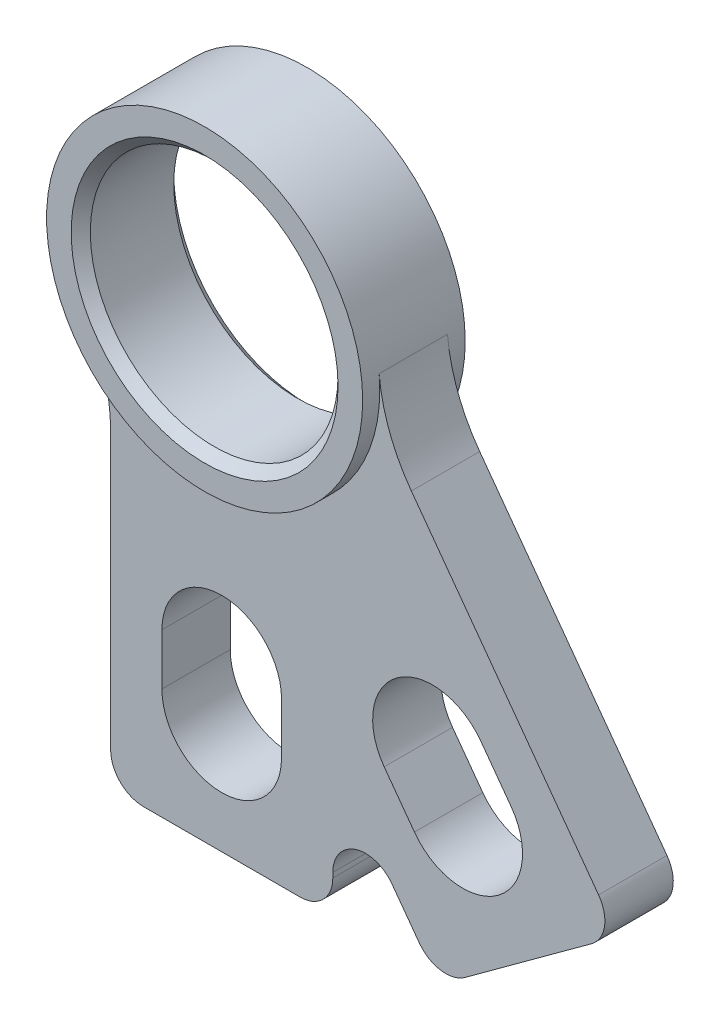
ISO-10303-21;
HEADER;
FILE_DESCRIPTION(('STEP AP214'),'2;1');
FILE_NAME('part.step','',(''),(''),'','','');
FILE_SCHEMA(('AUTOMOTIVE_DESIGN { 1 0 10303 214 1 1 1 1 }'));
ENDSEC;
DATA;
#1=APPLICATION_CONTEXT('core data for automotive mechanical design processes');
#2=APPLICATION_PROTOCOL_DEFINITION('international standard','automotive_design',2000,#1);
#3=PRODUCT_CONTEXT('',#1,'mechanical');
#4=PRODUCT('Part','Part','',(#3));
#5=PRODUCT_RELATED_PRODUCT_CATEGORY('part','',(#4));
#6=PRODUCT_DEFINITION_FORMATION('','',#4);
#7=PRODUCT_DEFINITION_CONTEXT('part definition',#1,'design');
#8=PRODUCT_DEFINITION('design','',#6,#7);
#9=PRODUCT_DEFINITION_SHAPE('','',#8);
#10=(LENGTH_UNIT() NAMED_UNIT(*) SI_UNIT(.MILLI.,.METRE.));
#11=(NAMED_UNIT(*) PLANE_ANGLE_UNIT() SI_UNIT($,.RADIAN.));
#12=(NAMED_UNIT(*) SI_UNIT($,.STERADIAN.) SOLID_ANGLE_UNIT());
#13=UNCERTAINTY_MEASURE_WITH_UNIT(LENGTH_MEASURE(1.E-05),#10,'distance_accuracy_value','');
#14=(GEOMETRIC_REPRESENTATION_CONTEXT(3) GLOBAL_UNCERTAINTY_ASSIGNED_CONTEXT((#13)) GLOBAL_UNIT_ASSIGNED_CONTEXT((#10,
#11,#12)) REPRESENTATION_CONTEXT('',''));
#15=CARTESIAN_POINT('',(0.,0.,0.));
#16=DIRECTION('',(0.,0.,1.));
#17=DIRECTION('',(1.,0.,0.));
#18=AXIS2_PLACEMENT_3D('',#15,#16,#17);
#19=CARTESIAN_POINT('',(0.,0.,4.7625));
#20=DIRECTION('',(0.,0.,-1.));
#21=DIRECTION('',(-1.,0.,0.));
#22=AXIS2_PLACEMENT_3D('',#19,#20,#21);
#23=CYLINDRICAL_SURFACE('',#22,11.5062);
#24=CARTESIAN_POINT('',(0.,0.,-3.87350000000002));
#25=DIRECTION('',(0.,0.,1.));
#26=DIRECTION('',(1.,0.,0.));
#27=AXIS2_PLACEMENT_3D('',#24,#25,#26);
#28=CIRCLE('',#27,11.5062);
#29=CARTESIAN_POINT('',(-11.5062,0.,-3.87350000000002));
#30=VERTEX_POINT('',#29);
#31=EDGE_CURVE('E48',#30,#30,#28,.F.);
#32=CARTESIAN_POINT('',(0.,0.,3.87349999999994));
#33=DIRECTION('',(0.,0.,1.));
#34=DIRECTION('',(1.,0.,0.));
#35=AXIS2_PLACEMENT_3D('',#32,#33,#34);
#36=CIRCLE('',#35,11.5062);
#37=CARTESIAN_POINT('',(-11.5062,0.,3.87349999999993));
#38=VERTEX_POINT('',#37);
#39=EDGE_CURVE('E423',#38,#38,#36,.T.);
#40=CARTESIAN_POINT('',(-11.5062,0.,-3.87350000000002));
#41=CARTESIAN_POINT('',(-11.5062,0.,-3.79280208333335));
#42=CARTESIAN_POINT('',(-11.5062,0.,-3.71210416666669));
#43=CARTESIAN_POINT('',(-11.5062,0.,-3.55070833333336));
#44=CARTESIAN_POINT('',(-11.5062,0.,-3.47001041666669));
#45=CARTESIAN_POINT('',(-11.5062,0.,-3.30861458333336));
#46=CARTESIAN_POINT('',(-11.5062,0.,-3.22791666666669));
#47=CARTESIAN_POINT('',(-11.5062,0.,-3.06652083333336));
#48=CARTESIAN_POINT('',(-11.5062,0.,-2.98582291666669));
#49=CARTESIAN_POINT('',(-11.5062,0.,-2.82442708333336));
#50=CARTESIAN_POINT('',(-11.5062,0.,-2.74372916666669));
#51=CARTESIAN_POINT('',(-11.5062,0.,-2.58233333333336));
#52=CARTESIAN_POINT('',(-11.5062,0.,-2.50163541666669));
#53=CARTESIAN_POINT('',(-11.5062,0.,-2.34023958333336));
#54=CARTESIAN_POINT('',(-11.5062,0.,-2.2595416666667));
#55=CARTESIAN_POINT('',(-11.5062,0.,-2.09814583333336));
#56=CARTESIAN_POINT('',(-11.5062,0.,-2.0174479166667));
#57=CARTESIAN_POINT('',(-11.5062,0.,-1.85605208333337));
#58=CARTESIAN_POINT('',(-11.5062,0.,-1.7753541666667));
#59=CARTESIAN_POINT('',(-11.5062,0.,-1.61395833333337));
#60=CARTESIAN_POINT('',(-11.5062,0.,-1.5332604166667));
#61=CARTESIAN_POINT('',(-11.5062,0.,-1.37186458333337));
#62=CARTESIAN_POINT('',(-11.5062,0.,-1.2911666666667));
#63=CARTESIAN_POINT('',(-11.5062,0.,-1.12977083333337));
#64=CARTESIAN_POINT('',(-11.5062,0.,-1.0490729166667));
#65=CARTESIAN_POINT('',(-11.5062,0.,-0.887677083333371));
#66=CARTESIAN_POINT('',(-11.5062,0.,-0.806979166666705));
#67=CARTESIAN_POINT('',(-11.5062,0.,-0.645583333333372));
#68=CARTESIAN_POINT('',(-11.5062,0.,-0.564885416666706));
#69=CARTESIAN_POINT('',(-11.5062,0.,-0.403489583333374));
#70=CARTESIAN_POINT('',(-11.5062,0.,-0.322791666666708));
#71=CARTESIAN_POINT('',(-11.5062,0.,-0.161395833333375));
#72=CARTESIAN_POINT('',(-11.5062,0.,-0.0806979166667089));
#73=CARTESIAN_POINT('',(-11.5062,0.,0.0806979166666236));
#74=CARTESIAN_POINT('',(-11.5062,0.,0.16139583333329));
#75=CARTESIAN_POINT('',(-11.5062,0.,0.322791666666622));
#76=CARTESIAN_POINT('',(-11.5062,0.,0.403489583333289));
#77=CARTESIAN_POINT('',(-11.5062,0.,0.564885416666621));
#78=CARTESIAN_POINT('',(-11.5062,0.,0.645583333333287));
#79=CARTESIAN_POINT('',(-11.5062,0.,0.80697916666662));
#80=CARTESIAN_POINT('',(-11.5062,0.,0.887677083333286));
#81=CARTESIAN_POINT('',(-11.5062,0.,1.04907291666662));
#82=CARTESIAN_POINT('',(-11.5062,0.,1.12977083333328));
#83=CARTESIAN_POINT('',(-11.5062,0.,1.29116666666662));
#84=CARTESIAN_POINT('',(-11.5062,0.,1.37186458333328));
#85=CARTESIAN_POINT('',(-11.5062,0.,1.53326041666662));
#86=CARTESIAN_POINT('',(-11.5062,0.,1.61395833333328));
#87=CARTESIAN_POINT('',(-11.5062,0.,1.77535416666661));
#88=CARTESIAN_POINT('',(-11.5062,0.,1.85605208333328));
#89=CARTESIAN_POINT('',(-11.5062,0.,2.01744791666661));
#90=CARTESIAN_POINT('',(-11.5062,0.,2.09814583333328));
#91=CARTESIAN_POINT('',(-11.5062,0.,2.25954166666661));
#92=CARTESIAN_POINT('',(-11.5062,0.,2.34023958333328));
#93=CARTESIAN_POINT('',(-11.5062,0.,2.50163541666661));
#94=CARTESIAN_POINT('',(-11.5062,0.,2.58233333333328));
#95=CARTESIAN_POINT('',(-11.5062,0.,2.74372916666661));
#96=CARTESIAN_POINT('',(-11.5062,0.,2.82442708333327));
#97=CARTESIAN_POINT('',(-11.5062,0.,2.98582291666661));
#98=CARTESIAN_POINT('',(-11.5062,0.,3.06652083333327));
#99=CARTESIAN_POINT('',(-11.5062,0.,3.22791666666661));
#100=CARTESIAN_POINT('',(-11.5062,0.,3.30861458333327));
#101=CARTESIAN_POINT('',(-11.5062,0.,3.4700104166666));
#102=CARTESIAN_POINT('',(-11.5062,0.,3.55070833333327));
#103=CARTESIAN_POINT('',(-11.5062,0.,3.7121041666666));
#104=CARTESIAN_POINT('',(-11.5062,0.,3.79280208333327));
#105=CARTESIAN_POINT('',(-11.5062,0.,3.87349999999994));
#106=B_SPLINE_CURVE_WITH_KNOTS('',3,(#40,#41,#42,#43,#44,#45,#46,#47,#48,#49,#50,#51,#52,#53,
#54,#55,#56,#57,#58,#59,#60,#61,#62,#63,#64,#65,#66,#67,#68,#69,#70,#71,#72,#73,#74,#75,#76,#77,
#78,#79,#80,#81,#82,#83,#84,#85,#86,#87,#88,#89,#90,#91,#92,#93,#94,#95,#96,#97,#98,#99,#100,
#101,#102,#103,#104,#105),.UNSPECIFIED.,.F.,.F.,(4,2,2,2,2,2,2,2,2,2,2,2,2,2,2,2,2,2,2,2,2,2,2,
2,2,2,2,2,2,2,2,2,4),(0.,0.242093749999998,0.484187499999997,0.726281249999995,
0.968374999999994,1.21046874999999,1.45256249999999,1.69465624999999,1.93674999999999,
2.17884374999999,2.42093749999999,2.66303124999998,2.90512499999998,3.14721874999998,
3.38931249999998,3.63140624999998,3.87349999999998,4.11559374999998,4.35768749999998,
4.59978124999997,4.84187499999997,5.08396874999997,5.32606249999997,5.56815624999997,
5.81024999999997,6.05234374999996,6.29443749999996,6.53653124999996,6.77862499999996,
7.02071874999996,7.26281249999996,7.50490624999996,7.74699999999995),.UNSPECIFIED.);
#107=EDGE_CURVE('BSEAM39',#30,#38,#106,.T.);
#108=ORIENTED_EDGE('',*,*,#31,.T.);
#109=ORIENTED_EDGE('',*,*,#39,.T.);
#110=ORIENTED_EDGE('',*,*,#107,.T.);
#111=ORIENTED_EDGE('',*,*,#107,.F.);
#112=EDGE_LOOP('',(#108,#110,#109,#111));
#113=FACE_BOUND('',#112,.T.);
#114=ADVANCED_FACE('F39',(#113),#23,.F.);
#115=CARTESIAN_POINT('',(0.,0.,4.7625));
#116=DIRECTION('',(0.,0.,-1.));
#117=DIRECTION('',(-1.,0.,0.));
#118=AXIS2_PLACEMENT_3D('',#115,#116,#117);
#119=CYLINDRICAL_SURFACE('',#118,14.6812);
#120=DIRECTION('',(0.,0.,-1.));
#121=VECTOR('',#120,1.);
#122=CARTESIAN_POINT('',(-12.585193266832,-7.55979787272687,3.175));
#123=LINE('',#122,#121);
#124=CARTESIAN_POINT('',(-12.585193266832,-7.55979787272688,3.175));
#125=VERTEX_POINT('',#124);
#126=CARTESIAN_POINT('',(-12.585193266832,-7.55979787272687,-3.175));
#127=VERTEX_POINT('',#126);
#128=EDGE_CURVE('E220',#125,#127,#123,.T.);
#129=ORIENTED_EDGE('',*,*,#128,.F.);
#130=CARTESIAN_POINT('',(0.,0.,3.175));
#131=DIRECTION('',(0.,0.,1.));
#132=DIRECTION('',(1.,0.,0.));
#133=AXIS2_PLACEMENT_3D('',#130,#131,#132);
#134=CIRCLE('',#133,14.6812);
#135=CARTESIAN_POINT('',(14.6214976963153,1.32266343286804,3.175));
#136=VERTEX_POINT('',#135);
#137=EDGE_CURVE('E237',#125,#136,#134,.T.);
#138=ORIENTED_EDGE('',*,*,#137,.T.);
#139=DIRECTION('',(0.,0.,-1.));
#140=VECTOR('',#139,1.);
#141=CARTESIAN_POINT('',(14.6214976963153,1.32266343286797,3.175));
#142=LINE('',#141,#140);
#143=CARTESIAN_POINT('',(14.6214976963153,1.32266343286797,-3.175));
#144=VERTEX_POINT('',#143);
#145=EDGE_CURVE('E285',#136,#144,#142,.T.);
#146=ORIENTED_EDGE('',*,*,#145,.T.);
#147=CARTESIAN_POINT('',(0.,0.,-3.175));
#148=DIRECTION('',(0.,0.,1.));
#149=DIRECTION('',(1.,0.,0.));
#150=AXIS2_PLACEMENT_3D('',#147,#148,#149);
#151=CIRCLE('',#150,14.6812);
#152=EDGE_CURVE('E286',#127,#144,#151,.T.);
#153=ORIENTED_EDGE('',*,*,#152,.F.);
#154=EDGE_LOOP('',(#129,#138,#146,#153));
#155=FACE_BOUND('',#154,.T.);
#156=CARTESIAN_POINT('',(0.,0.,4.7625));
#157=DIRECTION('',(0.,0.,1.));
#158=DIRECTION('',(1.,0.,0.));
#159=AXIS2_PLACEMENT_3D('',#156,#157,#158);
#160=CIRCLE('',#159,14.6812);
#161=CARTESIAN_POINT('',(14.6812,0.,4.7625));
#162=VERTEX_POINT('',#161);
#163=EDGE_CURVE('E363',#162,#162,#160,.T.);
#164=ORIENTED_EDGE('',*,*,#163,.F.);
#165=EDGE_LOOP('',(#164));
#166=FACE_BOUND('',#165,.T.);
#167=CARTESIAN_POINT('',(0.,0.,-4.7625));
#168=DIRECTION('',(0.,0.,1.));
#169=DIRECTION('',(1.,0.,0.));
#170=AXIS2_PLACEMENT_3D('',#167,#168,#169);
#171=CIRCLE('',#170,14.6812);
#172=CARTESIAN_POINT('',(14.6812,0.,-4.7625));
#173=VERTEX_POINT('',#172);
#174=EDGE_CURVE('E351',#173,#173,#171,.T.);
#175=ORIENTED_EDGE('',*,*,#174,.T.);
#176=EDGE_LOOP('',(#175));
#177=FACE_BOUND('',#176,.T.);
#178=ADVANCED_FACE('F444',(#155,#166,#177),#119,.T.);
#179=CARTESIAN_POINT('',(0.,0.,4.7625));
#180=DIRECTION('',(0.,0.,1.));
#181=DIRECTION('',(1.,0.,0.));
#182=AXIS2_PLACEMENT_3D('',#179,#180,#181);
#183=PLANE('',#182);
#184=CARTESIAN_POINT('',(0.,0.,4.7625));
#185=DIRECTION('',(0.,0.,1.));
#186=DIRECTION('',(1.,0.,0.));
#187=AXIS2_PLACEMENT_3D('',#184,#185,#186);
#188=CIRCLE('',#187,12.3952000000001);
#189=CARTESIAN_POINT('',(12.3952000000001,0.,4.7625));
#190=VERTEX_POINT('',#189);
#191=EDGE_CURVE('E11',#190,#190,#188,.F.);
#192=ORIENTED_EDGE('',*,*,#191,.T.);
#193=EDGE_LOOP('',(#192));
#194=FACE_BOUND('',#193,.T.);
#195=ORIENTED_EDGE('',*,*,#163,.T.);
#196=EDGE_LOOP('',(#195));
#197=FACE_BOUND('',#196,.T.);
#198=ADVANCED_FACE('F440',(#194,#197),#183,.T.);
#199=CARTESIAN_POINT('',(0.,0.,-4.7625));
#200=DIRECTION('',(0.,0.,1.));
#201=DIRECTION('',(1.,0.,0.));
#202=AXIS2_PLACEMENT_3D('',#199,#200,#201);
#203=PLANE('',#202);
#204=CARTESIAN_POINT('',(0.,0.,-4.7625));
#205=DIRECTION('',(0.,0.,1.));
#206=DIRECTION('',(1.,0.,0.));
#207=AXIS2_PLACEMENT_3D('',#204,#205,#206);
#208=CIRCLE('',#207,12.3952);
#209=CARTESIAN_POINT('',(-12.3952,0.,-4.7625));
#210=VERTEX_POINT('',#209);
#211=EDGE_CURVE('E420',#210,#210,#208,.T.);
#212=ORIENTED_EDGE('',*,*,#211,.T.);
#213=EDGE_LOOP('',(#212));
#214=FACE_BOUND('',#213,.T.);
#215=ORIENTED_EDGE('',*,*,#174,.F.);
#216=EDGE_LOOP('',(#215));
#217=FACE_BOUND('',#216,.T.);
#218=ADVANCED_FACE('F436',(#214,#217),#203,.F.);
#219=CARTESIAN_POINT('',(0.,-29.3687499999984,3.175));
#220=DIRECTION('',(0.,0.,-1.));
#221=DIRECTION('',(-1.,0.,0.));
#222=AXIS2_PLACEMENT_3D('',#219,#220,#221);
#223=CYLINDRICAL_SURFACE('',#222,5.55624999999838);
#224=CARTESIAN_POINT('',(0.,-29.3687499999984,-3.175));
#225=DIRECTION('',(0.,0.,1.));
#226=DIRECTION('',(1.,0.,0.));
#227=AXIS2_PLACEMENT_3D('',#224,#225,#226);
#228=CIRCLE('',#227,5.55624999999838);
#229=CARTESIAN_POINT('',(5.55624999999832,-29.3687499999984,-3.175));
#230=VERTEX_POINT('',#229);
#231=CARTESIAN_POINT('',(-5.55624999999843,-29.3687499999984,-3.175));
#232=VERTEX_POINT('',#231);
#233=EDGE_CURVE('E323',#230,#232,#228,.T.);
#234=ORIENTED_EDGE('',*,*,#233,.F.);
#235=DIRECTION('',(0.,0.,-1.));
#236=VECTOR('',#235,1.);
#237=CARTESIAN_POINT('',(5.55624999999832,-29.3687499999984,3.175));
#238=LINE('',#237,#236);
#239=CARTESIAN_POINT('',(5.55624999999832,-29.3687499999984,3.175));
#240=VERTEX_POINT('',#239);
#241=EDGE_CURVE('E348',#240,#230,#238,.T.);
#242=ORIENTED_EDGE('',*,*,#241,.F.);
#243=CARTESIAN_POINT('',(0.,-29.3687499999984,3.175));
#244=DIRECTION('',(0.,0.,1.));
#245=DIRECTION('',(1.,0.,0.));
#246=AXIS2_PLACEMENT_3D('',#243,#244,#245);
#247=CIRCLE('',#246,5.55624999999838);
#248=CARTESIAN_POINT('',(-5.55624999999843,-29.3687499999984,3.175));
#249=VERTEX_POINT('',#248);
#250=EDGE_CURVE('E270',#240,#249,#247,.T.);
#251=ORIENTED_EDGE('',*,*,#250,.T.);
#252=DIRECTION('',(0.,0.,-1.));
#253=VECTOR('',#252,1.);
#254=CARTESIAN_POINT('',(-5.55624999999843,-29.3687499999984,3.175));
#255=LINE('',#254,#253);
#256=EDGE_CURVE('E338',#249,#232,#255,.T.);
#257=ORIENTED_EDGE('',*,*,#256,.T.);
#258=EDGE_LOOP('',(#234,#242,#251,#257));
#259=FACE_BOUND('',#258,.T.);
#260=ADVANCED_FACE('F439',(#259),#223,.F.);
#261=CARTESIAN_POINT('',(5.55624999999833,0.,3.175));
#262=DIRECTION('',(-1.,0.,0.));
#263=DIRECTION('',(0.,-1.,0.));
#264=AXIS2_PLACEMENT_3D('',#261,#262,#263);
#265=PLANE('',#264);
#266=DIRECTION('',(0.,1.,0.));
#267=VECTOR('',#266,1.);
#268=CARTESIAN_POINT('',(5.55624999999833,0.,-3.175));
#269=LINE('',#268,#267);
#270=CARTESIAN_POINT('',(5.55624999999832,-34.1312500000016,-3.175));
#271=VERTEX_POINT('',#270);
#272=EDGE_CURVE('E327',#271,#230,#269,.T.);
#273=ORIENTED_EDGE('',*,*,#272,.F.);
#274=DIRECTION('',(0.,0.,-1.));
#275=VECTOR('',#274,1.);
#276=CARTESIAN_POINT('',(5.55624999999832,-34.1312500000016,3.175));
#277=LINE('',#276,#275);
#278=CARTESIAN_POINT('',(5.55624999999832,-34.1312500000016,3.175));
#279=VERTEX_POINT('',#278);
#280=EDGE_CURVE('E345',#279,#271,#277,.T.);
#281=ORIENTED_EDGE('',*,*,#280,.F.);
#282=DIRECTION('',(0.,1.,0.));
#283=VECTOR('',#282,1.);
#284=CARTESIAN_POINT('',(5.55624999999833,0.,3.175));
#285=LINE('',#284,#283);
#286=EDGE_CURVE('E274',#279,#240,#285,.T.);
#287=ORIENTED_EDGE('',*,*,#286,.T.);
#288=ORIENTED_EDGE('',*,*,#241,.T.);
#289=EDGE_LOOP('',(#273,#281,#287,#288));
#290=FACE_BOUND('',#289,.T.);
#291=ADVANCED_FACE('F583',(#290),#265,.T.);
#292=CARTESIAN_POINT('',(0.,-34.1312500000016,3.175));
#293=DIRECTION('',(0.,0.,-1.));
#294=DIRECTION('',(-1.,0.,0.));
#295=AXIS2_PLACEMENT_3D('',#292,#293,#294);
#296=CYLINDRICAL_SURFACE('',#295,5.55624999999838);
#297=CARTESIAN_POINT('',(0.,-34.1312500000016,-3.175));
#298=DIRECTION('',(0.,0.,1.));
#299=DIRECTION('',(1.,0.,0.));
#300=AXIS2_PLACEMENT_3D('',#297,#298,#299);
#301=CIRCLE('',#300,5.55624999999838);
#302=CARTESIAN_POINT('',(-5.55624999999843,-34.1312500000016,-3.175));
#303=VERTEX_POINT('',#302);
#304=EDGE_CURVE('E331',#303,#271,#301,.T.);
#305=ORIENTED_EDGE('',*,*,#304,.F.);
#306=DIRECTION('',(0.,0.,-1.));
#307=VECTOR('',#306,1.);
#308=CARTESIAN_POINT('',(-5.55624999999843,-34.1312500000016,3.175));
#309=LINE('',#308,#307);
#310=CARTESIAN_POINT('',(-5.55624999999843,-34.1312500000016,3.175));
#311=VERTEX_POINT('',#310);
#312=EDGE_CURVE('E341',#311,#303,#309,.T.);
#313=ORIENTED_EDGE('',*,*,#312,.F.);
#314=CARTESIAN_POINT('',(0.,-34.1312500000016,3.175));
#315=DIRECTION('',(0.,0.,1.));
#316=DIRECTION('',(1.,0.,0.));
#317=AXIS2_PLACEMENT_3D('',#314,#315,#316);
#318=CIRCLE('',#317,5.55624999999838);
#319=EDGE_CURVE('E278',#311,#279,#318,.T.);
#320=ORIENTED_EDGE('',*,*,#319,.T.);
#321=ORIENTED_EDGE('',*,*,#280,.T.);
#322=EDGE_LOOP('',(#305,#313,#320,#321));
#323=FACE_BOUND('',#322,.T.);
#324=ADVANCED_FACE('F550',(#323),#296,.F.);
#325=CARTESIAN_POINT('',(19.577669676264,-26.7870174078692,3.175));
#326=DIRECTION('',(0.,0.,-1.));
#327=DIRECTION('',(-1.,0.,0.));
#328=AXIS2_PLACEMENT_3D('',#325,#326,#327);
#329=CYLINDRICAL_SURFACE('',#328,5.5562499999983);
#330=CARTESIAN_POINT('',(19.577669676264,-26.7870174078692,-3.175));
#331=DIRECTION('',(0.,0.,1.));
#332=DIRECTION('',(1.,0.,0.));
#333=AXIS2_PLACEMENT_3D('',#330,#331,#332);
#334=CIRCLE('',#333,5.5562499999983);
#335=CARTESIAN_POINT('',(24.0635338354753,-23.5084602850507,-3.175));
#336=VERTEX_POINT('',#335);
#337=CARTESIAN_POINT('',(15.0918055170525,-30.0655745306877,-3.175));
#338=VERTEX_POINT('',#337);
#339=EDGE_CURVE('E311',#336,#338,#334,.T.);
#340=ORIENTED_EDGE('',*,*,#339,.F.);
#341=DIRECTION('',(0.,0.,-1.));
#342=VECTOR('',#341,1.);
#343=CARTESIAN_POINT('',(24.0635338354753,-23.5084602850507,3.175));
#344=LINE('',#343,#342);
#345=CARTESIAN_POINT('',(24.0635338354753,-23.5084602850507,3.175));
#346=VERTEX_POINT('',#345);
#347=EDGE_CURVE('E342',#346,#336,#344,.T.);
#348=ORIENTED_EDGE('',*,*,#347,.F.);
#349=CARTESIAN_POINT('',(19.577669676264,-26.7870174078692,3.175));
#350=DIRECTION('',(0.,0.,1.));
#351=DIRECTION('',(1.,0.,0.));
#352=AXIS2_PLACEMENT_3D('',#349,#350,#351);
#353=CIRCLE('',#352,5.5562499999983);
#354=CARTESIAN_POINT('',(15.0918055170525,-30.0655745306877,3.175));
#355=VERTEX_POINT('',#354);
#356=EDGE_CURVE('E259',#346,#355,#353,.T.);
#357=ORIENTED_EDGE('',*,*,#356,.T.);
#358=DIRECTION('',(0.,0.,-1.));
#359=VECTOR('',#358,1.);
#360=CARTESIAN_POINT('',(15.0918055170525,-30.0655745306877,3.175));
#361=LINE('',#360,#359);
#362=EDGE_CURVE('E352',#355,#338,#361,.T.);
#363=ORIENTED_EDGE('',*,*,#362,.T.);
#364=EDGE_LOOP('',(#340,#348,#357,#363));
#365=FACE_BOUND('',#364,.T.);
#366=ADVANCED_FACE('F542',(#365),#329,.F.);
#367=CARTESIAN_POINT('',(4.4858641592114,3.27855712281848,3.175));
#368=DIRECTION('',(-0.807354629329632,-0.590066523792032,0.));
#369=DIRECTION('',(0.590066523792032,-0.807354629329632,0.));
#370=AXIS2_PLACEMENT_3D('',#367,#368,#369);
#371=PLANE('',#370);
#372=DIRECTION('',(-0.590066523792032,0.807354629329632,0.));
#373=VECTOR('',#372,1.);
#374=CARTESIAN_POINT('',(4.4858641592114,3.27855712281848,-3.175));
#375=LINE('',#374,#373);
#376=CARTESIAN_POINT('',(26.8737256550367,-27.3534867072357,-3.175));
#377=VERTEX_POINT('',#376);
#378=EDGE_CURVE('E314',#377,#336,#375,.T.);
#379=ORIENTED_EDGE('',*,*,#378,.F.);
#380=DIRECTION('',(0.,0.,-1.));
#381=VECTOR('',#380,1.);
#382=CARTESIAN_POINT('',(26.8737256550367,-27.3534867072357,3.175));
#383=LINE('',#382,#381);
#384=CARTESIAN_POINT('',(26.8737256550367,-27.3534867072357,3.175));
#385=VERTEX_POINT('',#384);
#386=EDGE_CURVE('E356',#385,#377,#383,.T.);
#387=ORIENTED_EDGE('',*,*,#386,.F.);
#388=DIRECTION('',(-0.590066523792032,0.807354629329632,0.));
#389=VECTOR('',#388,1.);
#390=CARTESIAN_POINT('',(4.4858641592114,3.27855712281848,3.175));
#391=LINE('',#390,#389);
#392=EDGE_CURVE('E262',#385,#346,#391,.T.);
#393=ORIENTED_EDGE('',*,*,#392,.T.);
#394=ORIENTED_EDGE('',*,*,#347,.T.);
#395=EDGE_LOOP('',(#379,#387,#393,#394));
#396=FACE_BOUND('',#395,.T.);
#397=ADVANCED_FACE('F536',(#396),#371,.T.);
#398=CARTESIAN_POINT('',(22.3878614958254,-30.6320438300541,3.175));
#399=DIRECTION('',(0.,0.,-1.));
#400=DIRECTION('',(-1.,0.,0.));
#401=AXIS2_PLACEMENT_3D('',#398,#399,#400);
#402=CYLINDRICAL_SURFACE('',#401,5.5562499999983);
#403=CARTESIAN_POINT('',(22.3878614958254,-30.6320438300541,-3.175));
#404=DIRECTION('',(0.,0.,1.));
#405=DIRECTION('',(1.,0.,0.));
#406=AXIS2_PLACEMENT_3D('',#403,#404,#405);
#407=CIRCLE('',#406,5.5562499999983);
#408=CARTESIAN_POINT('',(17.901997336614,-33.9106009528726,-3.175));
#409=VERTEX_POINT('',#408);
#410=EDGE_CURVE('E317',#409,#377,#407,.T.);
#411=ORIENTED_EDGE('',*,*,#410,.F.);
#412=DIRECTION('',(0.,0.,-1.));
#413=VECTOR('',#412,1.);
#414=CARTESIAN_POINT('',(17.901997336614,-33.9106009528726,3.175));
#415=LINE('',#414,#413);
#416=CARTESIAN_POINT('',(17.901997336614,-33.9106009528726,3.175));
#417=VERTEX_POINT('',#416);
#418=EDGE_CURVE('E354',#417,#409,#415,.T.);
#419=ORIENTED_EDGE('',*,*,#418,.F.);
#420=CARTESIAN_POINT('',(22.3878614958254,-30.6320438300541,3.175));
#421=DIRECTION('',(0.,0.,1.));
#422=DIRECTION('',(1.,0.,0.));
#423=AXIS2_PLACEMENT_3D('',#420,#421,#422);
#424=CIRCLE('',#423,5.5562499999983);
#425=EDGE_CURVE('E265',#417,#385,#424,.T.);
#426=ORIENTED_EDGE('',*,*,#425,.T.);
#427=ORIENTED_EDGE('',*,*,#386,.T.);
#428=EDGE_LOOP('',(#411,#419,#426,#427));
#429=FACE_BOUND('',#428,.T.);
#430=ADVANCED_FACE('F532',(#429),#402,.F.);
#431=CARTESIAN_POINT('',(-26.1937499999968,-15.7343197939273,3.175));
#432=DIRECTION('',(0.,0.,-1.));
#433=DIRECTION('',(-1.,0.,0.));
#434=AXIS2_PLACEMENT_3D('',#431,#432,#433);
#435=CYLINDRICAL_SURFACE('',#434,15.8749999999984);
#436=CARTESIAN_POINT('',(-26.1937499999968,-15.7343197939273,-3.175));
#437=DIRECTION('',(0.,0.,1.));
#438=DIRECTION('',(1.,0.,0.));
#439=AXIS2_PLACEMENT_3D('',#436,#437,#438);
#440=CIRCLE('',#439,15.8749999999984);
#441=CARTESIAN_POINT('',(-10.3187499999984,-15.7343197939273,-3.175));
#442=VERTEX_POINT('',#441);
#443=EDGE_CURVE('E215',#442,#127,#440,.T.);
#444=ORIENTED_EDGE('',*,*,#443,.F.);
#445=DIRECTION('',(0.,0.,-1.));
#446=VECTOR('',#445,1.);
#447=CARTESIAN_POINT('',(-10.3187499999984,-15.7343197939273,3.175));
#448=LINE('',#447,#446);
#449=CARTESIAN_POINT('',(-10.3187499999984,-15.7343197939273,3.175));
#450=VERTEX_POINT('',#449);
#451=EDGE_CURVE('E208',#450,#442,#448,.T.);
#452=ORIENTED_EDGE('',*,*,#451,.F.);
#453=CARTESIAN_POINT('',(-26.1937499999968,-15.7343197939273,3.175));
#454=DIRECTION('',(0.,0.,1.));
#455=DIRECTION('',(1.,0.,0.));
#456=AXIS2_PLACEMENT_3D('',#453,#454,#455);
#457=CIRCLE('',#456,15.8749999999984);
#458=EDGE_CURVE('E213',#450,#125,#457,.T.);
#459=ORIENTED_EDGE('',*,*,#458,.T.);
#460=ORIENTED_EDGE('',*,*,#128,.T.);
#461=EDGE_LOOP('',(#444,#452,#459,#460));
#462=FACE_BOUND('',#461,.T.);
#463=ADVANCED_FACE('F210',(#462),#435,.F.);
#464=CARTESIAN_POINT('',(-10.3187499999983,0.,3.175));
#465=DIRECTION('',(1.,0.,0.));
#466=DIRECTION('',(0.,1.,0.));
#467=AXIS2_PLACEMENT_3D('',#464,#465,#466);
#468=PLANE('',#467);
#469=DIRECTION('',(0.,-1.,0.));
#470=VECTOR('',#469,1.);
#471=CARTESIAN_POINT('',(-10.3187499999983,0.,-3.175));
#472=LINE('',#471,#470);
#473=CARTESIAN_POINT('',(-10.3187499999984,-41.4019999999999,-3.175));
#474=VERTEX_POINT('',#473);
#475=EDGE_CURVE('E290',#442,#474,#472,.T.);
#476=ORIENTED_EDGE('',*,*,#475,.T.);
#477=DIRECTION('',(0.,0.,-1.));
#478=VECTOR('',#477,1.);
#479=CARTESIAN_POINT('',(-10.3187499999984,-41.4019999999999,3.175));
#480=LINE('',#479,#478);
#481=CARTESIAN_POINT('',(-10.3187499999984,-41.4019999999999,3.175));
#482=VERTEX_POINT('',#481);
#483=EDGE_CURVE('E227',#474,#482,#480,.F.);
#484=ORIENTED_EDGE('',*,*,#483,.T.);
#485=DIRECTION('',(0.,-1.,0.));
#486=VECTOR('',#485,1.);
#487=CARTESIAN_POINT('',(-10.3187499999983,0.,3.175));
#488=LINE('',#487,#486);
#489=EDGE_CURVE('E224',#450,#482,#488,.T.);
#490=ORIENTED_EDGE('',*,*,#489,.F.);
#491=ORIENTED_EDGE('',*,*,#451,.T.);
#492=EDGE_LOOP('',(#476,#484,#490,#491));
#493=FACE_BOUND('',#492,.T.);
#494=ADVANCED_FACE('F225',(#493),#468,.F.);
#495=CARTESIAN_POINT('',(-1.04617169628156E-13,-44.4499999999999,3.175));
#496=DIRECTION('',(0.,1.,0.));
#497=DIRECTION('',(-1.,0.,0.));
#498=AXIS2_PLACEMENT_3D('',#495,#496,#497);
#499=PLANE('',#498);
#500=DIRECTION('',(1.,0.,0.));
#501=VECTOR('',#500,1.);
#502=CARTESIAN_POINT('',(-1.04617169628156E-13,-44.4499999999999,-3.175));
#503=LINE('',#502,#501);
#504=CARTESIAN_POINT('',(-7.27074999999844,-44.4499999999999,-3.175));
#505=VERTEX_POINT('',#504);
#506=CARTESIAN_POINT('',(7.27074999999834,-44.45,-3.175));
#507=VERTEX_POINT('',#506);
#508=EDGE_CURVE('E293',#505,#507,#503,.T.);
#509=ORIENTED_EDGE('',*,*,#508,.T.);
#510=DIRECTION('',(0.,0.,-1.));
#511=VECTOR('',#510,1.);
#512=CARTESIAN_POINT('',(7.27074999999834,-44.45,3.175));
#513=LINE('',#512,#511);
#514=CARTESIAN_POINT('',(7.27074999999834,-44.45,3.175));
#515=VERTEX_POINT('',#514);
#516=EDGE_CURVE('E394',#507,#515,#513,.F.);
#517=ORIENTED_EDGE('',*,*,#516,.T.);
#518=DIRECTION('',(1.,0.,0.));
#519=VECTOR('',#518,1.);
#520=CARTESIAN_POINT('',(-1.04617169628156E-13,-44.4499999999999,3.175));
#521=LINE('',#520,#519);
#522=CARTESIAN_POINT('',(-7.27074999999844,-44.4499999999999,3.175));
#523=VERTEX_POINT('',#522);
#524=EDGE_CURVE('E230',#523,#515,#521,.T.);
#525=ORIENTED_EDGE('',*,*,#524,.F.);
#526=DIRECTION('',(0.,0.,-1.));
#527=VECTOR('',#526,1.);
#528=CARTESIAN_POINT('',(-7.27074999999844,-44.4499999999999,3.175));
#529=LINE('',#528,#527);
#530=EDGE_CURVE('E390',#523,#505,#529,.T.);
#531=ORIENTED_EDGE('',*,*,#530,.T.);
#532=EDGE_LOOP('',(#509,#517,#525,#531));
#533=FACE_BOUND('',#532,.T.);
#534=ADVANCED_FACE('F497',(#533),#499,.F.);
#535=CARTESIAN_POINT('',(10.3187499999982,0.,3.175));
#536=DIRECTION('',(-1.,0.,0.));
#537=DIRECTION('',(0.,-1.,0.));
#538=AXIS2_PLACEMENT_3D('',#535,#536,#537);
#539=PLANE('',#538);
#540=DIRECTION('',(0.,1.,0.));
#541=VECTOR('',#540,1.);
#542=CARTESIAN_POINT('',(10.3187499999982,0.,-3.175));
#543=LINE('',#542,#541);
#544=CARTESIAN_POINT('',(10.3187499999983,-41.402,-3.175));
#545=VERTEX_POINT('',#544);
#546=CARTESIAN_POINT('',(10.3187499999983,-40.9419218299925,-3.175));
#547=VERTEX_POINT('',#546);
#548=EDGE_CURVE('E297',#545,#547,#543,.T.);
#549=ORIENTED_EDGE('',*,*,#548,.T.);
#550=DIRECTION('',(0.,0.,-1.));
#551=VECTOR('',#550,1.);
#552=CARTESIAN_POINT('',(10.3187499999983,-40.9419218299925,3.175));
#553=LINE('',#552,#551);
#554=CARTESIAN_POINT('',(10.3187499999983,-40.9419218299925,3.175));
#555=VERTEX_POINT('',#554);
#556=EDGE_CURVE('E377',#547,#555,#553,.F.);
#557=ORIENTED_EDGE('',*,*,#556,.T.);
#558=DIRECTION('',(0.,1.,0.));
#559=VECTOR('',#558,1.);
#560=CARTESIAN_POINT('',(10.3187499999982,0.,3.175));
#561=LINE('',#560,#559);
#562=CARTESIAN_POINT('',(10.3187499999983,-41.402,3.175));
#563=VERTEX_POINT('',#562);
#564=EDGE_CURVE('E247',#563,#555,#561,.T.);
#565=ORIENTED_EDGE('',*,*,#564,.F.);
#566=DIRECTION('',(0.,0.,-1.));
#567=VECTOR('',#566,1.);
#568=CARTESIAN_POINT('',(10.3187499999983,-41.402,3.175));
#569=LINE('',#568,#567);
#570=EDGE_CURVE('E373',#563,#545,#569,.T.);
#571=ORIENTED_EDGE('',*,*,#570,.T.);
#572=EDGE_LOOP('',(#549,#557,#565,#571));
#573=FACE_BOUND('',#572,.T.);
#574=ADVANCED_FACE('F503',(#573),#539,.F.);
#575=CARTESIAN_POINT('',(-8.33089058139375,-6.08874894237801,3.175));
#576=DIRECTION('',(-0.807354629329632,-0.590066523792032,0.));
#577=DIRECTION('',(0.590066523792032,-0.807354629329632,0.));
#578=AXIS2_PLACEMENT_3D('',#575,#576,#577);
#579=PLANE('',#578);
#580=DIRECTION('',(-0.590066523792032,0.807354629329632,0.));
#581=VECTOR('',#580,1.);
#582=CARTESIAN_POINT('',(-8.33089058139375,-6.08874894237801,3.175));
#583=LINE('',#582,#581);
#584=CARTESIAN_POINT('',(18.3471970922916,-42.5908664436293,3.175));
#585=VERTEX_POINT('',#584);
#586=CARTESIAN_POINT('',(15.8275669101951,-39.1433990654744,3.175));
#587=VERTEX_POINT('',#586);
#588=EDGE_CURVE('E250',#585,#587,#583,.T.);
#589=ORIENTED_EDGE('',*,*,#588,.T.);
#590=DIRECTION('',(0.,0.,-1.));
#591=VECTOR('',#590,1.);
#592=CARTESIAN_POINT('',(15.8275669101951,-39.1433990654744,3.175));
#593=LINE('',#592,#591);
#594=CARTESIAN_POINT('',(15.8275669101951,-39.1433990654744,-3.175));
#595=VERTEX_POINT('',#594);
#596=EDGE_CURVE('E370',#587,#595,#593,.T.);
#597=ORIENTED_EDGE('',*,*,#596,.T.);
#598=DIRECTION('',(-0.590066523792032,0.807354629329632,0.));
#599=VECTOR('',#598,1.);
#600=CARTESIAN_POINT('',(-8.33089058139375,-6.08874894237801,-3.175));
#601=LINE('',#600,#599);
#602=CARTESIAN_POINT('',(18.3471970922916,-42.5908664436293,-3.175));
#603=VERTEX_POINT('',#602);
#604=EDGE_CURVE('E301',#603,#595,#601,.T.);
#605=ORIENTED_EDGE('',*,*,#604,.F.);
#606=DIRECTION('',(0.,0.,-1.));
#607=VECTOR('',#606,1.);
#608=CARTESIAN_POINT('',(18.3471970922916,-42.5908664436293,3.175));
#609=LINE('',#608,#607);
#610=EDGE_CURVE('E366',#603,#585,#609,.F.);
#611=ORIENTED_EDGE('',*,*,#610,.T.);
#612=EDGE_LOOP('',(#589,#597,#605,#611));
#613=FACE_BOUND('',#612,.T.);
#614=ADVANCED_FACE('F509',(#613),#579,.T.);
#615=CARTESIAN_POINT('',(28.4766104382034,-38.962934411448,3.175));
#616=DIRECTION('',(-0.590066523792032,0.807354629329632,0.));
#617=DIRECTION('',(-0.807354629329632,-0.590066523792032,0.));
#618=AXIS2_PLACEMENT_3D('',#615,#616,#617);
#619=PLANE('',#618);
#620=DIRECTION('',(0.807354629329632,0.590066523792032,0.));
#621=VECTOR('',#620,1.);
#622=CARTESIAN_POINT('',(28.4766104382034,-38.962934411448,3.175));
#623=LINE('',#622,#621);
#624=CARTESIAN_POINT('',(22.6065367670064,-43.2531605893079,3.175));
#625=VERTEX_POINT('',#624);
#626=CARTESIAN_POINT('',(34.3466841094006,-34.672708233588,3.175));
#627=VERTEX_POINT('',#626);
#628=EDGE_CURVE('E253',#625,#627,#623,.T.);
#629=ORIENTED_EDGE('',*,*,#628,.F.);
#630=DIRECTION('',(0.,0.,-1.));
#631=VECTOR('',#630,1.);
#632=CARTESIAN_POINT('',(22.6065367670064,-43.2531605893079,-3.175));
#633=LINE('',#632,#631);
#634=CARTESIAN_POINT('',(22.6065367670064,-43.2531605893079,-3.175));
#635=VERTEX_POINT('',#634);
#636=EDGE_CURVE('E407',#625,#635,#633,.T.);
#637=ORIENTED_EDGE('',*,*,#636,.T.);
#638=DIRECTION('',(0.807354629329632,0.590066523792032,0.));
#639=VECTOR('',#638,1.);
#640=CARTESIAN_POINT('',(28.4766104382034,-38.962934411448,-3.175));
#641=LINE('',#640,#639);
#642=CARTESIAN_POINT('',(34.3466841094006,-34.672708233588,-3.175));
#643=VERTEX_POINT('',#642);
#644=EDGE_CURVE('E304',#635,#643,#641,.T.);
#645=ORIENTED_EDGE('',*,*,#644,.T.);
#646=DIRECTION('',(0.,0.,-1.));
#647=VECTOR('',#646,1.);
#648=CARTESIAN_POINT('',(34.3466841094006,-34.672708233588,3.175));
#649=LINE('',#648,#647);
#650=EDGE_CURVE('E63',#643,#627,#649,.F.);
#651=ORIENTED_EDGE('',*,*,#650,.T.);
#652=EDGE_LOOP('',(#629,#637,#645,#651));
#653=FACE_BOUND('',#652,.T.);
#654=ADVANCED_FACE('F513',(#653),#619,.F.);
#655=CARTESIAN_POINT('',(8.33089058139354,6.08874894237797,3.175));
#656=DIRECTION('',(-0.807354629329627,-0.590066523792039,0.));
#657=DIRECTION('',(0.590066523792039,-0.807354629329627,0.));
#658=AXIS2_PLACEMENT_3D('',#655,#656,#657);
#659=PLANE('',#658);
#660=DIRECTION('',(-0.590066523792039,0.807354629329627,0.));
#661=VECTOR('',#660,1.);
#662=CARTESIAN_POINT('',(8.33089058139354,6.08874894237797,3.175));
#663=LINE('',#662,#661);
#664=CARTESIAN_POINT('',(35.0089782550792,-30.4133685588732,3.175));
#665=VERTEX_POINT('',#664);
#666=CARTESIAN_POINT('',(17.6151859664287,-6.61442698260227,3.175));
#667=VERTEX_POINT('',#666);
#668=EDGE_CURVE('E255',#665,#667,#663,.T.);
#669=ORIENTED_EDGE('',*,*,#668,.F.);
#670=DIRECTION('',(0.,0.,-1.));
#671=VECTOR('',#670,1.);
#672=CARTESIAN_POINT('',(35.0089782550792,-30.4133685588731,3.175));
#673=LINE('',#672,#671);
#674=CARTESIAN_POINT('',(35.0089782550792,-30.4133685588732,-3.175));
#675=VERTEX_POINT('',#674);
#676=EDGE_CURVE('E412',#665,#675,#673,.T.);
#677=ORIENTED_EDGE('',*,*,#676,.T.);
#678=DIRECTION('',(-0.590066523792039,0.807354629329627,0.));
#679=VECTOR('',#678,1.);
#680=CARTESIAN_POINT('',(8.33089058139354,6.08874894237797,-3.175));
#681=LINE('',#680,#679);
#682=CARTESIAN_POINT('',(17.6151859664287,-6.61442698260227,-3.175));
#683=VERTEX_POINT('',#682);
#684=EDGE_CURVE('E306',#675,#683,#681,.T.);
#685=ORIENTED_EDGE('',*,*,#684,.T.);
#686=DIRECTION('',(0.,0.,-1.));
#687=VECTOR('',#686,1.);
#688=CARTESIAN_POINT('',(17.6151859664287,-6.61442698260227,3.175));
#689=LINE('',#688,#687);
#690=EDGE_CURVE('E221',#667,#683,#689,.T.);
#691=ORIENTED_EDGE('',*,*,#690,.F.);
#692=EDGE_LOOP('',(#669,#677,#685,#691));
#693=FACE_BOUND('',#692,.T.);
#694=ADVANCED_FACE('F481',(#693),#659,.F.);
#695=CARTESIAN_POINT('',(-4.48586415921139,-3.27855712281846,3.175));
#696=DIRECTION('',(-0.807354629329632,-0.590066523792032,0.));
#697=DIRECTION('',(0.590066523792032,-0.807354629329632,0.));
#698=AXIS2_PLACEMENT_3D('',#695,#696,#697);
#699=PLANE('',#698);
#700=DIRECTION('',(-0.590066523792032,0.807354629329632,0.));
#701=VECTOR('',#700,1.);
#702=CARTESIAN_POINT('',(-4.48586415921139,-3.27855712281846,-3.175));
#703=LINE('',#702,#701);
#704=EDGE_CURVE('E320',#409,#338,#703,.T.);
#705=ORIENTED_EDGE('',*,*,#704,.T.);
#706=ORIENTED_EDGE('',*,*,#362,.F.);
#707=DIRECTION('',(-0.590066523792032,0.807354629329632,0.));
#708=VECTOR('',#707,1.);
#709=CARTESIAN_POINT('',(-4.48586415921139,-3.27855712281846,3.175));
#710=LINE('',#709,#708);
#711=EDGE_CURVE('E268',#417,#355,#710,.T.);
#712=ORIENTED_EDGE('',*,*,#711,.F.);
#713=ORIENTED_EDGE('',*,*,#418,.T.);
#714=EDGE_LOOP('',(#705,#706,#712,#713));
#715=FACE_BOUND('',#714,.T.);
#716=ADVANCED_FACE('F520',(#715),#699,.F.);
#717=CARTESIAN_POINT('',(30.4319407070353,2.75287908259546,3.175));
#718=DIRECTION('',(0.,0.,-1.));
#719=DIRECTION('',(-1.,0.,0.));
#720=AXIS2_PLACEMENT_3D('',#717,#718,#719);
#721=CYLINDRICAL_SURFACE('',#720,15.8749999999985);
#722=CARTESIAN_POINT('',(30.4319407070353,2.75287908259546,-3.175));
#723=DIRECTION('',(0.,0.,1.));
#724=DIRECTION('',(1.,0.,0.));
#725=AXIS2_PLACEMENT_3D('',#722,#723,#724);
#726=CIRCLE('',#725,15.8749999999985);
#727=EDGE_CURVE('E308',#683,#144,#726,.F.);
#728=ORIENTED_EDGE('',*,*,#727,.T.);
#729=ORIENTED_EDGE('',*,*,#145,.F.);
#730=CARTESIAN_POINT('',(30.4319407070353,2.75287908259546,3.175));
#731=DIRECTION('',(0.,0.,1.));
#732=DIRECTION('',(1.,0.,0.));
#733=AXIS2_PLACEMENT_3D('',#730,#731,#732);
#734=CIRCLE('',#733,15.8749999999985);
#735=EDGE_CURVE('E257',#667,#136,#734,.F.);
#736=ORIENTED_EDGE('',*,*,#735,.F.);
#737=ORIENTED_EDGE('',*,*,#690,.T.);
#738=EDGE_LOOP('',(#728,#729,#736,#737));
#739=FACE_BOUND('',#738,.T.);
#740=ADVANCED_FACE('F490',(#739),#721,.F.);
#741=CARTESIAN_POINT('',(-5.55624999999842,0.,3.175));
#742=DIRECTION('',(-1.,0.,0.));
#743=DIRECTION('',(0.,-1.,0.));
#744=AXIS2_PLACEMENT_3D('',#741,#742,#743);
#745=PLANE('',#744);
#746=DIRECTION('',(0.,1.,0.));
#747=VECTOR('',#746,1.);
#748=CARTESIAN_POINT('',(-5.55624999999842,0.,-3.175));
#749=LINE('',#748,#747);
#750=EDGE_CURVE('E242',#303,#232,#749,.T.);
#751=ORIENTED_EDGE('',*,*,#750,.T.);
#752=ORIENTED_EDGE('',*,*,#256,.F.);
#753=DIRECTION('',(0.,1.,0.));
#754=VECTOR('',#753,1.);
#755=CARTESIAN_POINT('',(-5.55624999999842,0.,3.175));
#756=LINE('',#755,#754);
#757=EDGE_CURVE('E282',#311,#249,#756,.T.);
#758=ORIENTED_EDGE('',*,*,#757,.F.);
#759=ORIENTED_EDGE('',*,*,#312,.T.);
#760=EDGE_LOOP('',(#751,#752,#758,#759));
#761=FACE_BOUND('',#760,.T.);
#762=ADVANCED_FACE('F553',(#761),#745,.F.);
#763=CARTESIAN_POINT('',(0.,0.,3.175));
#764=DIRECTION('',(0.,0.,1.));
#765=DIRECTION('',(1.,0.,0.));
#766=AXIS2_PLACEMENT_3D('',#763,#764,#765);
#767=PLANE('',#766);
#768=ORIENTED_EDGE('',*,*,#524,.T.);
#769=CARTESIAN_POINT('',(7.27074999999834,-41.402,3.175));
#770=DIRECTION('',(0.,0.,1.));
#771=DIRECTION('',(1.,0.,0.));
#772=AXIS2_PLACEMENT_3D('',#769,#770,#771);
#773=CIRCLE('',#772,3.048);
#774=EDGE_CURVE('E403',#515,#563,#773,.T.);
#775=ORIENTED_EDGE('',*,*,#774,.T.);
#776=ORIENTED_EDGE('',*,*,#564,.T.);
#777=CARTESIAN_POINT('',(13.3667499999983,-40.9419218299925,3.175));
#778=DIRECTION('',(0.,0.,1.));
#779=DIRECTION('',(1.,0.,0.));
#780=AXIS2_PLACEMENT_3D('',#777,#778,#779);
#781=CIRCLE('',#780,3.048);
#782=EDGE_CURVE('E418',#555,#587,#781,.F.);
#783=ORIENTED_EDGE('',*,*,#782,.T.);
#784=ORIENTED_EDGE('',*,*,#588,.F.);
#785=CARTESIAN_POINT('',(20.8080140024883,-40.7923436791112,3.175));
#786=DIRECTION('',(0.,0.,1.));
#787=DIRECTION('',(1.,0.,0.));
#788=AXIS2_PLACEMENT_3D('',#785,#786,#787);
#789=CIRCLE('',#788,3.048);
#790=EDGE_CURVE('E401',#585,#625,#789,.T.);
#791=ORIENTED_EDGE('',*,*,#790,.T.);
#792=ORIENTED_EDGE('',*,*,#628,.T.);
#793=CARTESIAN_POINT('',(32.5481613448825,-32.2118913233913,3.175));
#794=DIRECTION('',(0.,0.,1.));
#795=DIRECTION('',(1.,0.,0.));
#796=AXIS2_PLACEMENT_3D('',#793,#794,#795);
#797=CIRCLE('',#796,3.048);
#798=EDGE_CURVE('E55',#627,#665,#797,.T.);
#799=ORIENTED_EDGE('',*,*,#798,.T.);
#800=ORIENTED_EDGE('',*,*,#668,.T.);
#801=ORIENTED_EDGE('',*,*,#735,.T.);
#802=ORIENTED_EDGE('',*,*,#137,.F.);
#803=ORIENTED_EDGE('',*,*,#458,.F.);
#804=ORIENTED_EDGE('',*,*,#489,.T.);
#805=CARTESIAN_POINT('',(-7.27074999999843,-41.4019999999999,3.175));
#806=DIRECTION('',(0.,0.,1.));
#807=DIRECTION('',(1.,0.,0.));
#808=AXIS2_PLACEMENT_3D('',#805,#806,#807);
#809=CIRCLE('',#808,3.048);
#810=EDGE_CURVE('E398',#482,#523,#809,.T.);
#811=ORIENTED_EDGE('',*,*,#810,.T.);
#812=EDGE_LOOP('',(#768,#775,#776,#783,#784,#791,#792,#799,#800,#801,#802,#803,#804,#811));
#813=FACE_BOUND('',#812,.T.);
#814=ORIENTED_EDGE('',*,*,#356,.F.);
#815=ORIENTED_EDGE('',*,*,#392,.F.);
#816=ORIENTED_EDGE('',*,*,#425,.F.);
#817=ORIENTED_EDGE('',*,*,#711,.T.);
#818=EDGE_LOOP('',(#814,#815,#816,#817));
#819=FACE_BOUND('',#818,.T.);
#820=ORIENTED_EDGE('',*,*,#250,.F.);
#821=ORIENTED_EDGE('',*,*,#286,.F.);
#822=ORIENTED_EDGE('',*,*,#319,.F.);
#823=ORIENTED_EDGE('',*,*,#757,.T.);
#824=EDGE_LOOP('',(#820,#821,#822,#823));
#825=FACE_BOUND('',#824,.T.);
#826=ADVANCED_FACE('F234',(#813,#819,#825),#767,.T.);
#827=CARTESIAN_POINT('',(0.,0.,-3.175));
#828=DIRECTION('',(0.,0.,1.));
#829=DIRECTION('',(1.,0.,0.));
#830=AXIS2_PLACEMENT_3D('',#827,#828,#829);
#831=PLANE('',#830);
#832=ORIENTED_EDGE('',*,*,#548,.F.);
#833=CARTESIAN_POINT('',(7.27074999999834,-41.402,-3.175));
#834=DIRECTION('',(0.,0.,1.));
#835=DIRECTION('',(1.,0.,0.));
#836=AXIS2_PLACEMENT_3D('',#833,#834,#835);
#837=CIRCLE('',#836,3.048);
#838=EDGE_CURVE('E387',#545,#507,#837,.F.);
#839=ORIENTED_EDGE('',*,*,#838,.T.);
#840=ORIENTED_EDGE('',*,*,#508,.F.);
#841=CARTESIAN_POINT('',(-7.27074999999843,-41.4019999999999,-3.175));
#842=DIRECTION('',(0.,0.,1.));
#843=DIRECTION('',(1.,0.,0.));
#844=AXIS2_PLACEMENT_3D('',#841,#842,#843);
#845=CIRCLE('',#844,3.048);
#846=EDGE_CURVE('E382',#505,#474,#845,.F.);
#847=ORIENTED_EDGE('',*,*,#846,.T.);
#848=ORIENTED_EDGE('',*,*,#475,.F.);
#849=ORIENTED_EDGE('',*,*,#443,.T.);
#850=ORIENTED_EDGE('',*,*,#152,.T.);
#851=ORIENTED_EDGE('',*,*,#727,.F.);
#852=ORIENTED_EDGE('',*,*,#684,.F.);
#853=CARTESIAN_POINT('',(32.5481613448825,-32.2118913233913,-3.175));
#854=DIRECTION('',(0.,0.,1.));
#855=DIRECTION('',(1.,0.,0.));
#856=AXIS2_PLACEMENT_3D('',#853,#854,#855);
#857=CIRCLE('',#856,3.048);
#858=EDGE_CURVE('E380',#675,#643,#857,.F.);
#859=ORIENTED_EDGE('',*,*,#858,.T.);
#860=ORIENTED_EDGE('',*,*,#644,.F.);
#861=CARTESIAN_POINT('',(20.8080140024883,-40.7923436791112,-3.175));
#862=DIRECTION('',(0.,0.,1.));
#863=DIRECTION('',(1.,0.,0.));
#864=AXIS2_PLACEMENT_3D('',#861,#862,#863);
#865=CIRCLE('',#864,3.048);
#866=EDGE_CURVE('E385',#635,#603,#865,.F.);
#867=ORIENTED_EDGE('',*,*,#866,.T.);
#868=ORIENTED_EDGE('',*,*,#604,.T.);
#869=CARTESIAN_POINT('',(13.3667499999983,-40.9419218299925,-3.175));
#870=DIRECTION('',(0.,0.,1.));
#871=DIRECTION('',(1.,0.,0.));
#872=AXIS2_PLACEMENT_3D('',#869,#870,#871);
#873=CIRCLE('',#872,3.048);
#874=EDGE_CURVE('E415',#595,#547,#873,.T.);
#875=ORIENTED_EDGE('',*,*,#874,.T.);
#876=EDGE_LOOP('',(#832,#839,#840,#847,#848,#849,#850,#851,#852,#859,#860,#867,#868,#875));
#877=FACE_BOUND('',#876,.T.);
#878=ORIENTED_EDGE('',*,*,#339,.T.);
#879=ORIENTED_EDGE('',*,*,#704,.F.);
#880=ORIENTED_EDGE('',*,*,#410,.T.);
#881=ORIENTED_EDGE('',*,*,#378,.T.);
#882=EDGE_LOOP('',(#878,#879,#880,#881));
#883=FACE_BOUND('',#882,.T.);
#884=ORIENTED_EDGE('',*,*,#233,.T.);
#885=ORIENTED_EDGE('',*,*,#750,.F.);
#886=ORIENTED_EDGE('',*,*,#304,.T.);
#887=ORIENTED_EDGE('',*,*,#272,.T.);
#888=EDGE_LOOP('',(#884,#885,#886,#887));
#889=FACE_BOUND('',#888,.T.);
#890=ADVANCED_FACE('F461',(#877,#883,#889),#831,.F.);
#891=CARTESIAN_POINT('',(13.3667499999983,-40.9419218299925,3.175));
#892=DIRECTION('',(0.,0.,-1.));
#893=DIRECTION('',(-1.,0.,0.));
#894=AXIS2_PLACEMENT_3D('',#891,#892,#893);
#895=CYLINDRICAL_SURFACE('',#894,3.048);
#896=ORIENTED_EDGE('',*,*,#782,.F.);
#897=ORIENTED_EDGE('',*,*,#556,.F.);
#898=ORIENTED_EDGE('',*,*,#874,.F.);
#899=ORIENTED_EDGE('',*,*,#596,.F.);
#900=EDGE_LOOP('',(#896,#897,#898,#899));
#901=FACE_BOUND('',#900,.T.);
#902=ADVANCED_FACE('F457',(#901),#895,.F.);
#903=CARTESIAN_POINT('',(7.27074999999834,-41.402,3.175));
#904=DIRECTION('',(0.,0.,-1.));
#905=DIRECTION('',(-1.,0.,0.));
#906=AXIS2_PLACEMENT_3D('',#903,#904,#905);
#907=CYLINDRICAL_SURFACE('',#906,3.048);
#908=ORIENTED_EDGE('',*,*,#774,.F.);
#909=ORIENTED_EDGE('',*,*,#516,.F.);
#910=ORIENTED_EDGE('',*,*,#838,.F.);
#911=ORIENTED_EDGE('',*,*,#570,.F.);
#912=EDGE_LOOP('',(#908,#909,#910,#911));
#913=FACE_BOUND('',#912,.T.);
#914=ADVANCED_FACE('F460',(#913),#907,.T.);
#915=CARTESIAN_POINT('',(20.8080140024883,-40.7923436791112,3.175));
#916=DIRECTION('',(0.,0.,1.));
#917=DIRECTION('',(1.,0.,0.));
#918=AXIS2_PLACEMENT_3D('',#915,#916,#917);
#919=CYLINDRICAL_SURFACE('',#918,3.048);
#920=ORIENTED_EDGE('',*,*,#790,.F.);
#921=ORIENTED_EDGE('',*,*,#610,.F.);
#922=ORIENTED_EDGE('',*,*,#866,.F.);
#923=ORIENTED_EDGE('',*,*,#636,.F.);
#924=EDGE_LOOP('',(#920,#921,#922,#923));
#925=FACE_BOUND('',#924,.T.);
#926=ADVANCED_FACE('F465',(#925),#919,.T.);
#927=CARTESIAN_POINT('',(-7.27074999999843,-41.4019999999999,3.175));
#928=DIRECTION('',(0.,0.,-1.));
#929=DIRECTION('',(-1.,0.,0.));
#930=AXIS2_PLACEMENT_3D('',#927,#928,#929);
#931=CYLINDRICAL_SURFACE('',#930,3.048);
#932=ORIENTED_EDGE('',*,*,#810,.F.);
#933=ORIENTED_EDGE('',*,*,#483,.F.);
#934=ORIENTED_EDGE('',*,*,#846,.F.);
#935=ORIENTED_EDGE('',*,*,#530,.F.);
#936=EDGE_LOOP('',(#932,#933,#934,#935));
#937=FACE_BOUND('',#936,.T.);
#938=ADVANCED_FACE('F469',(#937),#931,.T.);
#939=CARTESIAN_POINT('',(32.5481613448825,-32.2118913233913,3.175));
#940=DIRECTION('',(0.,0.,-1.));
#941=DIRECTION('',(-1.,0.,0.));
#942=AXIS2_PLACEMENT_3D('',#939,#940,#941);
#943=CYLINDRICAL_SURFACE('',#942,3.048);
#944=ORIENTED_EDGE('',*,*,#798,.F.);
#945=ORIENTED_EDGE('',*,*,#650,.F.);
#946=ORIENTED_EDGE('',*,*,#858,.F.);
#947=ORIENTED_EDGE('',*,*,#676,.F.);
#948=EDGE_LOOP('',(#944,#945,#946,#947));
#949=FACE_BOUND('',#948,.T.);
#950=ADVANCED_FACE('F433',(#949),#943,.T.);
#951=CARTESIAN_POINT('',(0.,0.,-4.7625));
#952=DIRECTION('',(0.,0.,-1.));
#953=DIRECTION('',(-1.,0.,0.));
#954=AXIS2_PLACEMENT_3D('',#951,#952,#953);
#955=CONICAL_SURFACE('',#954,12.3952,0.785398163397449);
#956=CARTESIAN_POINT('',(-11.5062,0.,-3.87350000000002));
#957=CARTESIAN_POINT('',(-11.5154604166667,0.,-3.88276041666669));
#958=CARTESIAN_POINT('',(-11.5247208333333,0.,-3.89202083333335));
#959=CARTESIAN_POINT('',(-11.5432416666667,0.,-3.91054166666669));
#960=CARTESIAN_POINT('',(-11.5525020833333,0.,-3.91980208333335));
#961=CARTESIAN_POINT('',(-11.5710229166667,0.,-3.93832291666669));
#962=CARTESIAN_POINT('',(-11.5802833333333,0.,-3.94758333333335));
#963=CARTESIAN_POINT('',(-11.5988041666667,0.,-3.96610416666668));
#964=CARTESIAN_POINT('',(-11.6080645833333,0.,-3.97536458333335));
#965=CARTESIAN_POINT('',(-11.6265854166667,0.,-3.99388541666668));
#966=CARTESIAN_POINT('',(-11.6358458333333,0.,-4.00314583333335));
#967=CARTESIAN_POINT('',(-11.6543666666667,0.,-4.02166666666668));
#968=CARTESIAN_POINT('',(-11.6636270833333,0.,-4.03092708333335));
#969=CARTESIAN_POINT('',(-11.6821479166667,0.,-4.04944791666668));
#970=CARTESIAN_POINT('',(-11.6914083333333,0.,-4.05870833333335));
#971=CARTESIAN_POINT('',(-11.7099291666667,0.,-4.07722916666668));
#972=CARTESIAN_POINT('',(-11.7191895833333,0.,-4.08648958333335));
#973=CARTESIAN_POINT('',(-11.7377104166667,0.,-4.10501041666668));
#974=CARTESIAN_POINT('',(-11.7469708333333,0.,-4.11427083333335));
#975=CARTESIAN_POINT('',(-11.7654916666667,0.,-4.13279166666668));
#976=CARTESIAN_POINT('',(-11.7747520833333,0.,-4.14205208333335));
#977=CARTESIAN_POINT('',(-11.7932729166667,0.,-4.16057291666668));
#978=CARTESIAN_POINT('',(-11.8025333333333,0.,-4.16983333333335));
#979=CARTESIAN_POINT('',(-11.8210541666667,0.,-4.18835416666668));
#980=CARTESIAN_POINT('',(-11.8303145833333,0.,-4.19761458333335));
#981=CARTESIAN_POINT('',(-11.8488354166667,0.,-4.21613541666668));
#982=CARTESIAN_POINT('',(-11.8580958333333,0.,-4.22539583333335));
#983=CARTESIAN_POINT('',(-11.8766166666667,0.,-4.24391666666668));
#984=CARTESIAN_POINT('',(-11.8858770833333,0.,-4.25317708333335));
#985=CARTESIAN_POINT('',(-11.9043979166667,0.,-4.27169791666668));
#986=CARTESIAN_POINT('',(-11.9136583333333,0.,-4.28095833333334));
#987=CARTESIAN_POINT('',(-11.9321791666667,0.,-4.29947916666668));
#988=CARTESIAN_POINT('',(-11.9414395833333,0.,-4.30873958333334));
#989=CARTESIAN_POINT('',(-11.9599604166667,0.,-4.32726041666668));
#990=CARTESIAN_POINT('',(-11.9692208333333,0.,-4.33652083333334));
#991=CARTESIAN_POINT('',(-11.9877416666667,0.,-4.35504166666668));
#992=CARTESIAN_POINT('',(-11.9970020833333,0.,-4.36430208333334));
#993=CARTESIAN_POINT('',(-12.0155229166667,0.,-4.38282291666668));
#994=CARTESIAN_POINT('',(-12.0247833333333,0.,-4.39208333333334));
#995=CARTESIAN_POINT('',(-12.0433041666667,0.,-4.41060416666667));
#996=CARTESIAN_POINT('',(-12.0525645833333,0.,-4.41986458333334));
#997=CARTESIAN_POINT('',(-12.0710854166667,0.,-4.43838541666667));
#998=CARTESIAN_POINT('',(-12.0803458333333,0.,-4.44764583333334));
#999=CARTESIAN_POINT('',(-12.0988666666667,0.,-4.46616666666668));
#1000=CARTESIAN_POINT('',(-12.1081270833333,0.,-4.47542708333334));
#1001=CARTESIAN_POINT('',(-12.1266479166667,0.,-4.49394791666667));
#1002=CARTESIAN_POINT('',(-12.1359083333333,0.,-4.50320833333334));
#1003=CARTESIAN_POINT('',(-12.1544291666667,0.,-4.52172916666667));
#1004=CARTESIAN_POINT('',(-12.1636895833333,0.,-4.53098958333334));
#1005=CARTESIAN_POINT('',(-12.1822104166667,0.,-4.54951041666667));
#1006=CARTESIAN_POINT('',(-12.1914708333333,0.,-4.55877083333334));
#1007=CARTESIAN_POINT('',(-12.2099916666667,0.,-4.57729166666667));
#1008=CARTESIAN_POINT('',(-12.2192520833333,0.,-4.58655208333334));
#1009=CARTESIAN_POINT('',(-12.2377729166666,0.,-4.60507291666667));
#1010=CARTESIAN_POINT('',(-12.2470333333333,0.,-4.61433333333334));
#1011=CARTESIAN_POINT('',(-12.2655541666666,0.,-4.63285416666667));
#1012=CARTESIAN_POINT('',(-12.2748145833333,0.,-4.64211458333334));
#1013=CARTESIAN_POINT('',(-12.2933354166667,0.,-4.66063541666667));
#1014=CARTESIAN_POINT('',(-12.3025958333333,0.,-4.66989583333334));
#1015=CARTESIAN_POINT('',(-12.3211166666666,0.,-4.68841666666667));
#1016=CARTESIAN_POINT('',(-12.3303770833333,0.,-4.69767708333334));
#1017=CARTESIAN_POINT('',(-12.3488979166666,0.,-4.71619791666667));
#1018=CARTESIAN_POINT('',(-12.3581583333333,0.,-4.72545833333333));
#1019=CARTESIAN_POINT('',(-12.3766791666666,0.,-4.74397916666667));
#1020=CARTESIAN_POINT('',(-12.3859395833333,0.,-4.75323958333333));
#1021=CARTESIAN_POINT('',(-12.3952,0.,-4.7625));
#1022=B_SPLINE_CURVE_WITH_KNOTS('',3,(#956,#957,#958,#959,#960,#961,#962,#963,#964,#965,#966,
#967,#968,#969,#970,#971,#972,#973,#974,#975,#976,#977,#978,#979,#980,#981,#982,#983,#984,#985,
#986,#987,#988,#989,#990,#991,#992,#993,#994,#995,#996,#997,#998,#999,#1000,#1001,#1002,#1003,
#1004,#1005,#1006,#1007,#1008,#1009,#1010,#1011,#1012,#1013,#1014,#1015,#1016,#1017,#1018,#1019,
#1020,#1021),.UNSPECIFIED.,.F.,.F.,(4,2,2,2,2,2,2,2,2,2,2,2,2,2,2,2,2,2,2,2,2,2,2,2,2,2,2,2,2,2,
2,2,4),(0.,0.0392886205296764,0.078577241059353,0.117865861589031,0.157154482118707,
0.196443102648384,0.23573172317806,0.275020343707737,0.314308964237413,0.353597584767091,
0.392886205296768,0.432174825826444,0.47146344635612,0.510752066885797,0.550040687415474,
0.589329307945151,0.628617928474828,0.667906549004505,0.707195169534181,0.746483790063857,
0.785772410593534,0.82506103112321,0.864349651652888,0.903638272182564,0.942926892712241,
0.982215513241918,1.02150413377159,1.06079275430127,1.10008137483095,1.13936999536063,
1.1786586158903,1.21794723641998,1.25723585694965),.UNSPECIFIED.);
#1023=EDGE_CURVE('BSEAM430',#30,#210,#1022,.T.);
#1024=ORIENTED_EDGE('',*,*,#31,.F.);
#1025=ORIENTED_EDGE('',*,*,#211,.F.);
#1026=ORIENTED_EDGE('',*,*,#1023,.T.);
#1027=ORIENTED_EDGE('',*,*,#1023,.F.);
#1028=EDGE_LOOP('',(#1024,#1026,#1025,#1027));
#1029=FACE_BOUND('',#1028,.T.);
#1030=ADVANCED_FACE('F430',(#1029),#955,.F.);
#1031=CARTESIAN_POINT('',(0.,0.,3.87349999999994));
#1032=DIRECTION('',(0.,0.,1.));
#1033=DIRECTION('',(1.,0.,0.));
#1034=AXIS2_PLACEMENT_3D('',#1031,#1032,#1033);
#1035=CONICAL_SURFACE('',#1034,11.5062,0.785398163397447);
#1036=ORIENTED_EDGE('',*,*,#191,.F.);
#1037=EDGE_LOOP('',(#1036));
#1038=FACE_BOUND('',#1037,.T.);
#1039=ORIENTED_EDGE('',*,*,#39,.F.);
#1040=EDGE_LOOP('',(#1039));
#1041=FACE_BOUND('',#1040,.T.);
#1042=ADVANCED_FACE('F41',(#1038,#1041),#1035,.F.);
#1043=CLOSED_SHELL('',(#114,#178,#198,#218,#260,#291,#324,#366,#397,#430,#463,#494,#534,#574,
#614,#654,#694,#716,#740,#762,#826,#890,#902,#914,#926,#938,#950,#1030,#1042));
#1044=MANIFOLD_SOLID_BREP('B2',#1043);
#1045=ADVANCED_BREP_SHAPE_REPRESENTATION('',(#18,#1044),#14);
#1046=SHAPE_DEFINITION_REPRESENTATION(#9,#1045);
ENDSEC;
END-ISO-10303-21;
